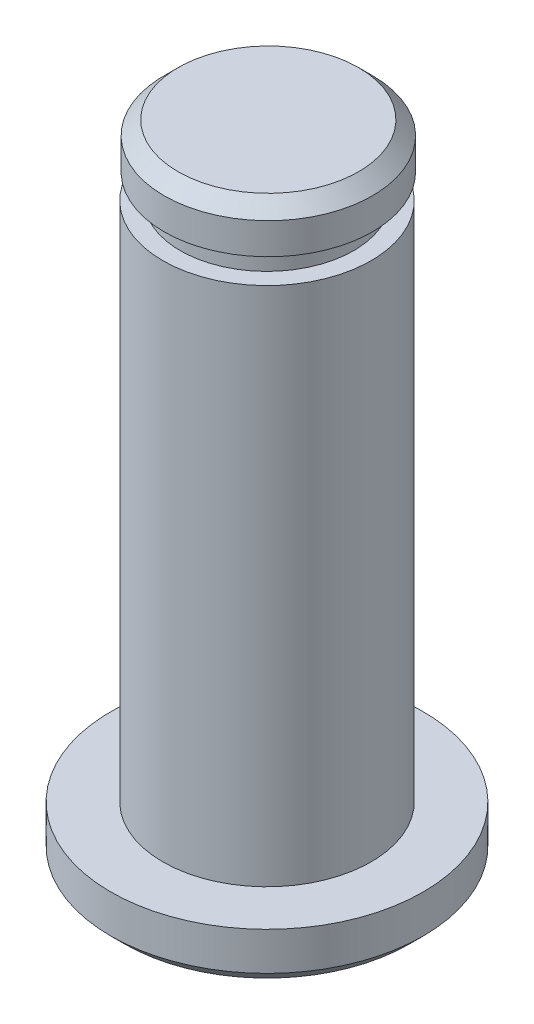
ISO-10303-21;
HEADER;
FILE_DESCRIPTION(('STEP AP214'),'2;1');
FILE_NAME('part.step','',(''),(''),'','','');
FILE_SCHEMA(('AUTOMOTIVE_DESIGN { 1 0 10303 214 1 1 1 1 }'));
ENDSEC;
DATA;
#1=APPLICATION_CONTEXT('core data for automotive mechanical design processes');
#2=APPLICATION_PROTOCOL_DEFINITION('international standard','automotive_design',2000,#1);
#3=PRODUCT_CONTEXT('',#1,'mechanical');
#4=PRODUCT('Part','Part','',(#3));
#5=PRODUCT_RELATED_PRODUCT_CATEGORY('part','',(#4));
#6=PRODUCT_DEFINITION_FORMATION('','',#4);
#7=PRODUCT_DEFINITION_CONTEXT('part definition',#1,'design');
#8=PRODUCT_DEFINITION('design','',#6,#7);
#9=PRODUCT_DEFINITION_SHAPE('','',#8);
#10=(LENGTH_UNIT() NAMED_UNIT(*) SI_UNIT(.MILLI.,.METRE.));
#11=(NAMED_UNIT(*) PLANE_ANGLE_UNIT() SI_UNIT($,.RADIAN.));
#12=(NAMED_UNIT(*) SI_UNIT($,.STERADIAN.) SOLID_ANGLE_UNIT());
#13=UNCERTAINTY_MEASURE_WITH_UNIT(LENGTH_MEASURE(1.E-05),#10,'distance_accuracy_value','');
#14=(GEOMETRIC_REPRESENTATION_CONTEXT(3) GLOBAL_UNCERTAINTY_ASSIGNED_CONTEXT((#13)) GLOBAL_UNIT_ASSIGNED_CONTEXT((#10,
#11,#12)) REPRESENTATION_CONTEXT('',''));
#15=CARTESIAN_POINT('',(0.,0.,0.));
#16=DIRECTION('',(0.,0.,1.));
#17=DIRECTION('',(1.,0.,0.));
#18=AXIS2_PLACEMENT_3D('',#15,#16,#17);
#19=CARTESIAN_POINT('',(0.,18.1,-0.038502673796736));
#20=DIRECTION('',(0.,-1.,0.));
#21=DIRECTION('',(0.,0.,-1.));
#22=AXIS2_PLACEMENT_3D('',#19,#20,#21);
#23=CONICAL_SURFACE('',#22,3.,0.785398163397447);
#24=CARTESIAN_POINT('',(0.,18.1,-0.038502673796736));
#25=DIRECTION('',(0.,-1.,0.));
#26=DIRECTION('',(0.,0.,-1.));
#27=AXIS2_PLACEMENT_3D('',#24,#25,#26);
#28=CIRCLE('',#27,3.);
#29=CARTESIAN_POINT('',(0.,18.1,-3.03850267379674));
#30=VERTEX_POINT('',#29);
#31=EDGE_CURVE('E84',#30,#30,#28,.T.);
#32=ORIENTED_EDGE('',*,*,#31,.F.);
#33=EDGE_LOOP('',(#32));
#34=FACE_BOUND('',#33,.T.);
#35=CARTESIAN_POINT('',(0.,18.5,-0.038502673796736));
#36=DIRECTION('',(0.,1.,0.));
#37=DIRECTION('',(0.,0.,-1.));
#38=AXIS2_PLACEMENT_3D('',#35,#36,#37);
#39=CIRCLE('',#38,2.6);
#40=CARTESIAN_POINT('',(0.,18.5,-2.63850267379674));
#41=VERTEX_POINT('',#40);
#42=EDGE_CURVE('E10',#41,#41,#39,.T.);
#43=ORIENTED_EDGE('',*,*,#42,.F.);
#44=EDGE_LOOP('',(#43));
#45=FACE_BOUND('',#44,.T.);
#46=ADVANCED_FACE('F16',(#34,#45),#23,.T.);
#47=CARTESIAN_POINT('',(0.,0.4,0.));
#48=DIRECTION('',(0.,1.,0.));
#49=DIRECTION('',(0.,0.,1.));
#50=AXIS2_PLACEMENT_3D('',#47,#48,#49);
#51=CONICAL_SURFACE('',#50,4.5,0.785398163397449);
#52=CARTESIAN_POINT('',(0.,0.4,0.));
#53=DIRECTION('',(0.,1.,0.));
#54=DIRECTION('',(0.,0.,1.));
#55=AXIS2_PLACEMENT_3D('',#52,#53,#54);
#56=CIRCLE('',#55,4.5);
#57=CARTESIAN_POINT('',(0.,0.4,4.5));
#58=VERTEX_POINT('',#57);
#59=EDGE_CURVE('E100',#58,#58,#56,.T.);
#60=ORIENTED_EDGE('',*,*,#59,.F.);
#61=EDGE_LOOP('',(#60));
#62=FACE_BOUND('',#61,.T.);
#63=CARTESIAN_POINT('',(0.,0.,0.));
#64=DIRECTION('',(0.,-1.,0.));
#65=DIRECTION('',(0.,0.,1.));
#66=AXIS2_PLACEMENT_3D('',#63,#64,#65);
#67=CIRCLE('',#66,4.1);
#68=CARTESIAN_POINT('',(0.,0.,4.1));
#69=VERTEX_POINT('',#68);
#70=EDGE_CURVE('E65',#69,#69,#67,.T.);
#71=ORIENTED_EDGE('',*,*,#70,.F.);
#72=EDGE_LOOP('',(#71));
#73=FACE_BOUND('',#72,.T.);
#74=ADVANCED_FACE('F121',(#62,#73),#51,.T.);
#75=CARTESIAN_POINT('',(0.,17.2,-0.038502673796736));
#76=DIRECTION('',(0.,-1.,0.));
#77=DIRECTION('',(0.,0.,-1.));
#78=AXIS2_PLACEMENT_3D('',#75,#76,#77);
#79=PLANE('',#78);
#80=CARTESIAN_POINT('',(0.,17.2,-0.038502673796736));
#81=DIRECTION('',(0.,-1.,0.));
#82=DIRECTION('',(0.,0.,-1.));
#83=AXIS2_PLACEMENT_3D('',#80,#81,#82);
#84=CIRCLE('',#83,3.);
#85=CARTESIAN_POINT('',(0.,17.2,-3.03850267379674));
#86=VERTEX_POINT('',#85);
#87=EDGE_CURVE('E26',#86,#86,#84,.T.);
#88=ORIENTED_EDGE('',*,*,#87,.T.);
#89=EDGE_LOOP('',(#88));
#90=FACE_BOUND('',#89,.T.);
#91=CARTESIAN_POINT('',(0.,17.2,0.));
#92=DIRECTION('',(0.,-1.,0.));
#93=DIRECTION('',(0.,0.,-1.));
#94=AXIS2_PLACEMENT_3D('',#91,#92,#93);
#95=CIRCLE('',#94,2.5);
#96=CARTESIAN_POINT('',(0.,17.2,-2.5));
#97=VERTEX_POINT('',#96);
#98=EDGE_CURVE('E79',#97,#97,#95,.T.);
#99=ORIENTED_EDGE('',*,*,#98,.F.);
#100=EDGE_LOOP('',(#99));
#101=FACE_BOUND('',#100,.T.);
#102=ADVANCED_FACE('F124',(#90,#101),#79,.T.);
#103=CARTESIAN_POINT('',(0.,18.5,-0.038502673796736));
#104=DIRECTION('',(0.,-1.,0.));
#105=DIRECTION('',(0.,0.,-1.));
#106=AXIS2_PLACEMENT_3D('',#103,#104,#105);
#107=PLANE('',#106);
#108=ORIENTED_EDGE('',*,*,#42,.T.);
#109=EDGE_LOOP('',(#108));
#110=FACE_BOUND('',#109,.T.);
#111=ADVANCED_FACE('F131',(#110),#107,.F.);
#112=CARTESIAN_POINT('',(0.,18.5,-0.038502673796736));
#113=DIRECTION('',(0.,-1.,0.));
#114=DIRECTION('',(0.,0.,-1.));
#115=AXIS2_PLACEMENT_3D('',#112,#113,#114);
#116=CYLINDRICAL_SURFACE('',#115,3.);
#117=ORIENTED_EDGE('',*,*,#87,.F.);
#118=EDGE_LOOP('',(#117));
#119=FACE_BOUND('',#118,.T.);
#120=ORIENTED_EDGE('',*,*,#31,.T.);
#121=EDGE_LOOP('',(#120));
#122=FACE_BOUND('',#121,.T.);
#123=ADVANCED_FACE('F85',(#119,#122),#116,.T.);
#124=CARTESIAN_POINT('',(0.,17.2,0.));
#125=DIRECTION('',(0.,-1.,0.));
#126=DIRECTION('',(0.,0.,-1.));
#127=AXIS2_PLACEMENT_3D('',#124,#125,#126);
#128=CYLINDRICAL_SURFACE('',#127,2.5);
#129=CARTESIAN_POINT('',(0.,16.5,0.));
#130=DIRECTION('',(0.,-1.,0.));
#131=DIRECTION('',(0.,0.,-1.));
#132=AXIS2_PLACEMENT_3D('',#129,#130,#131);
#133=CIRCLE('',#132,2.5);
#134=CARTESIAN_POINT('',(0.,16.5,-2.5));
#135=VERTEX_POINT('',#134);
#136=EDGE_CURVE('E19',#135,#135,#133,.T.);
#137=ORIENTED_EDGE('',*,*,#136,.F.);
#138=EDGE_LOOP('',(#137));
#139=FACE_BOUND('',#138,.T.);
#140=ORIENTED_EDGE('',*,*,#98,.T.);
#141=EDGE_LOOP('',(#140));
#142=FACE_BOUND('',#141,.T.);
#143=ADVANCED_FACE('F145',(#139,#142),#128,.T.);
#144=CARTESIAN_POINT('',(0.,16.5,0.));
#145=DIRECTION('',(0.,-1.,0.));
#146=DIRECTION('',(0.,0.,-1.));
#147=AXIS2_PLACEMENT_3D('',#144,#145,#146);
#148=PLANE('',#147);
#149=CARTESIAN_POINT('',(0.,16.5,0.));
#150=DIRECTION('',(0.,-1.,0.));
#151=DIRECTION('',(0.,0.,-1.));
#152=AXIS2_PLACEMENT_3D('',#149,#150,#151);
#153=CIRCLE('',#152,3.);
#154=CARTESIAN_POINT('',(0.,16.5,-3.));
#155=VERTEX_POINT('',#154);
#156=EDGE_CURVE('E99',#155,#155,#153,.T.);
#157=ORIENTED_EDGE('',*,*,#156,.F.);
#158=EDGE_LOOP('',(#157));
#159=FACE_BOUND('',#158,.T.);
#160=ORIENTED_EDGE('',*,*,#136,.T.);
#161=EDGE_LOOP('',(#160));
#162=FACE_BOUND('',#161,.T.);
#163=ADVANCED_FACE('F139',(#159,#162),#148,.F.);
#164=CARTESIAN_POINT('',(0.,16.5,0.));
#165=DIRECTION('',(0.,-1.,0.));
#166=DIRECTION('',(0.,0.,-1.));
#167=AXIS2_PLACEMENT_3D('',#164,#165,#166);
#168=CYLINDRICAL_SURFACE('',#167,3.);
#169=CARTESIAN_POINT('',(0.,1.5,0.));
#170=DIRECTION('',(0.,-1.,0.));
#171=DIRECTION('',(0.,0.,-1.));
#172=AXIS2_PLACEMENT_3D('',#169,#170,#171);
#173=CIRCLE('',#172,3.);
#174=CARTESIAN_POINT('',(0.,1.5,-3.));
#175=VERTEX_POINT('',#174);
#176=EDGE_CURVE('E55',#175,#175,#173,.T.);
#177=ORIENTED_EDGE('',*,*,#176,.F.);
#178=EDGE_LOOP('',(#177));
#179=FACE_BOUND('',#178,.T.);
#180=ORIENTED_EDGE('',*,*,#156,.T.);
#181=EDGE_LOOP('',(#180));
#182=FACE_BOUND('',#181,.T.);
#183=ADVANCED_FACE('F136',(#179,#182),#168,.T.);
#184=CARTESIAN_POINT('',(0.,0.,0.));
#185=DIRECTION('',(0.,1.,0.));
#186=DIRECTION('',(1.,0.,0.));
#187=AXIS2_PLACEMENT_3D('',#184,#185,#186);
#188=PLANE('',#187);
#189=ORIENTED_EDGE('',*,*,#70,.T.);
#190=EDGE_LOOP('',(#189));
#191=FACE_BOUND('',#190,.T.);
#192=ADVANCED_FACE('F138',(#191),#188,.F.);
#193=CARTESIAN_POINT('',(0.,1.5,0.));
#194=DIRECTION('',(0.,1.,0.));
#195=DIRECTION('',(1.,0.,0.));
#196=AXIS2_PLACEMENT_3D('',#193,#194,#195);
#197=PLANE('',#196);
#198=CARTESIAN_POINT('',(0.,1.5,0.));
#199=DIRECTION('',(0.,1.,0.));
#200=DIRECTION('',(1.,0.,0.));
#201=AXIS2_PLACEMENT_3D('',#198,#199,#200);
#202=CIRCLE('',#201,4.5);
#203=CARTESIAN_POINT('',(4.5,1.5,0.));
#204=VERTEX_POINT('',#203);
#205=EDGE_CURVE('E103',#204,#204,#202,.T.);
#206=ORIENTED_EDGE('',*,*,#205,.T.);
#207=EDGE_LOOP('',(#206));
#208=FACE_BOUND('',#207,.T.);
#209=ORIENTED_EDGE('',*,*,#176,.T.);
#210=EDGE_LOOP('',(#209));
#211=FACE_BOUND('',#210,.T.);
#212=ADVANCED_FACE('F113',(#208,#211),#197,.T.);
#213=CARTESIAN_POINT('',(0.,1.5,0.));
#214=DIRECTION('',(0.,-1.,0.));
#215=DIRECTION('',(0.,0.,-1.));
#216=AXIS2_PLACEMENT_3D('',#213,#214,#215);
#217=CYLINDRICAL_SURFACE('',#216,4.5);
#218=ORIENTED_EDGE('',*,*,#205,.F.);
#219=EDGE_LOOP('',(#218));
#220=FACE_BOUND('',#219,.T.);
#221=ORIENTED_EDGE('',*,*,#59,.T.);
#222=EDGE_LOOP('',(#221));
#223=FACE_BOUND('',#222,.T.);
#224=ADVANCED_FACE('F115',(#220,#223),#217,.T.);
#225=CLOSED_SHELL('',(#46,#74,#102,#111,#123,#143,#163,#183,#192,#212,#224));
#226=MANIFOLD_SOLID_BREP('B1',#225);
#227=ADVANCED_BREP_SHAPE_REPRESENTATION('',(#18,#226),#14);
#228=SHAPE_DEFINITION_REPRESENTATION(#9,#227);
ENDSEC;
END-ISO-10303-21;
